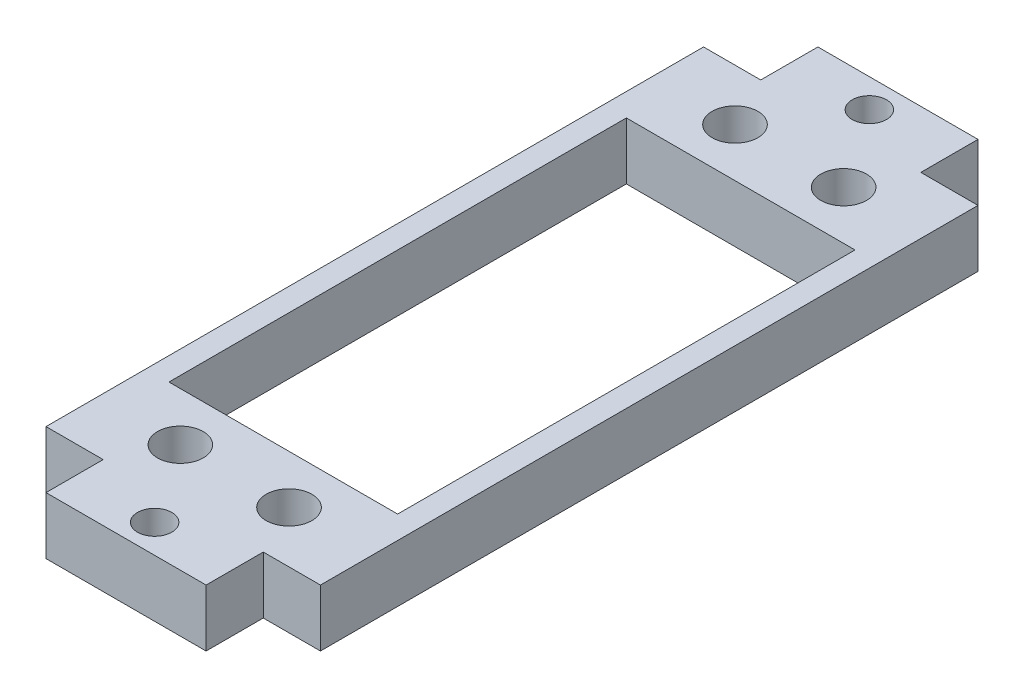
ISO-10303-21;
HEADER;
FILE_DESCRIPTION(('STEP AP214'),'2;1');
FILE_NAME('part.step','',(''),(''),'','','');
FILE_SCHEMA(('AUTOMOTIVE_DESIGN { 1 0 10303 214 1 1 1 1 }'));
ENDSEC;
DATA;
#1=APPLICATION_CONTEXT('core data for automotive mechanical design processes');
#2=APPLICATION_PROTOCOL_DEFINITION('international standard','automotive_design',2000,#1);
#3=PRODUCT_CONTEXT('',#1,'mechanical');
#4=PRODUCT('Part','Part','',(#3));
#5=PRODUCT_RELATED_PRODUCT_CATEGORY('part','',(#4));
#6=PRODUCT_DEFINITION_FORMATION('','',#4);
#7=PRODUCT_DEFINITION_CONTEXT('part definition',#1,'design');
#8=PRODUCT_DEFINITION('design','',#6,#7);
#9=PRODUCT_DEFINITION_SHAPE('','',#8);
#10=(LENGTH_UNIT() NAMED_UNIT(*) SI_UNIT(.MILLI.,.METRE.));
#11=(NAMED_UNIT(*) PLANE_ANGLE_UNIT() SI_UNIT($,.RADIAN.));
#12=(NAMED_UNIT(*) SI_UNIT($,.STERADIAN.) SOLID_ANGLE_UNIT());
#13=UNCERTAINTY_MEASURE_WITH_UNIT(LENGTH_MEASURE(1.E-05),#10,'distance_accuracy_value','');
#14=(GEOMETRIC_REPRESENTATION_CONTEXT(3) GLOBAL_UNCERTAINTY_ASSIGNED_CONTEXT((#13)) GLOBAL_UNIT_ASSIGNED_CONTEXT((#10,
#11,#12)) REPRESENTATION_CONTEXT('',''));
#15=CARTESIAN_POINT('',(0.,0.,0.));
#16=DIRECTION('',(0.,0.,1.));
#17=DIRECTION('',(1.,0.,0.));
#18=AXIS2_PLACEMENT_3D('',#15,#16,#17);
#19=CARTESIAN_POINT('',(0.,5.,0.));
#20=DIRECTION('',(0.,1.,0.));
#21=DIRECTION('',(0.,0.,1.));
#22=AXIS2_PLACEMENT_3D('',#19,#20,#21);
#23=PLANE('',#22);
#24=CARTESIAN_POINT('',(16.75,5.,-9.50000000000001));
#25=DIRECTION('',(0.,1.,0.));
#26=DIRECTION('',(0.,0.,-1.));
#27=AXIS2_PLACEMENT_3D('',#24,#25,#26);
#28=CIRCLE('',#27,2.);
#29=CARTESIAN_POINT('',(16.75,5.,-11.5));
#30=VERTEX_POINT('',#29);
#31=EDGE_CURVE('E545',#30,#30,#28,.T.);
#32=ORIENTED_EDGE('',*,*,#31,.F.);
#33=EDGE_LOOP('',(#32));
#34=FACE_BOUND('',#33,.T.);
#35=CARTESIAN_POINT('',(16.75,5.,-58.));
#36=DIRECTION('',(0.,1.,0.));
#37=DIRECTION('',(0.,0.,1.));
#38=AXIS2_PLACEMENT_3D('',#35,#36,#37);
#39=CIRCLE('',#38,2.);
#40=CARTESIAN_POINT('',(16.75,5.,-56.));
#41=VERTEX_POINT('',#40);
#42=EDGE_CURVE('E557',#41,#41,#39,.T.);
#43=ORIENTED_EDGE('',*,*,#42,.F.);
#44=EDGE_LOOP('',(#43));
#45=FACE_BOUND('',#44,.T.);
#46=CARTESIAN_POINT('',(12.,5.,-65.));
#47=DIRECTION('',(0.,1.,0.));
#48=DIRECTION('',(0.,0.,1.));
#49=AXIS2_PLACEMENT_3D('',#46,#47,#48);
#50=CIRCLE('',#49,1.5);
#51=CARTESIAN_POINT('',(12.,5.,-63.5));
#52=VERTEX_POINT('',#51);
#53=EDGE_CURVE('E175',#52,#52,#50,.T.);
#54=ORIENTED_EDGE('',*,*,#53,.F.);
#55=EDGE_LOOP('',(#54));
#56=FACE_BOUND('',#55,.T.);
#57=DIRECTION('',(0.,0.,1.));
#58=VECTOR('',#57,1.);
#59=CARTESIAN_POINT('',(5.,5.,-67.5));
#60=LINE('',#59,#58);
#61=CARTESIAN_POINT('',(5.,5.,-67.5));
#62=VERTEX_POINT('',#61);
#63=CARTESIAN_POINT('',(5.,5.,-62.5));
#64=VERTEX_POINT('',#63);
#65=EDGE_CURVE('E185',#62,#64,#60,.T.);
#66=ORIENTED_EDGE('',*,*,#65,.T.);
#67=DIRECTION('',(-1.,0.,0.));
#68=VECTOR('',#67,1.);
#69=CARTESIAN_POINT('',(0.,5.,-62.5));
#70=LINE('',#69,#68);
#71=CARTESIAN_POINT('',(0.,5.,-62.5));
#72=VERTEX_POINT('',#71);
#73=EDGE_CURVE('E188',#64,#72,#70,.T.);
#74=ORIENTED_EDGE('',*,*,#73,.T.);
#75=DIRECTION('',(0.,0.,1.));
#76=VECTOR('',#75,1.);
#77=CARTESIAN_POINT('',(0.,5.,-5.));
#78=LINE('',#77,#76);
#79=CARTESIAN_POINT('',(0.,5.,-5.));
#80=VERTEX_POINT('',#79);
#81=EDGE_CURVE('E191',#72,#80,#78,.T.);
#82=ORIENTED_EDGE('',*,*,#81,.T.);
#83=DIRECTION('',(1.,0.,0.));
#84=VECTOR('',#83,1.);
#85=CARTESIAN_POINT('',(0.,5.,-5.));
#86=LINE('',#85,#84);
#87=CARTESIAN_POINT('',(5.,5.,-5.));
#88=VERTEX_POINT('',#87);
#89=EDGE_CURVE('E193',#80,#88,#86,.T.);
#90=ORIENTED_EDGE('',*,*,#89,.T.);
#91=DIRECTION('',(0.,0.,1.));
#92=VECTOR('',#91,1.);
#93=CARTESIAN_POINT('',(5.,5.,0.));
#94=LINE('',#93,#92);
#95=CARTESIAN_POINT('',(5.,5.,0.));
#96=VERTEX_POINT('',#95);
#97=EDGE_CURVE('E195',#88,#96,#94,.T.);
#98=ORIENTED_EDGE('',*,*,#97,.T.);
#99=DIRECTION('',(1.,0.,0.));
#100=VECTOR('',#99,1.);
#101=CARTESIAN_POINT('',(5.,5.,0.));
#102=LINE('',#101,#100);
#103=CARTESIAN_POINT('',(19.,5.,0.));
#104=VERTEX_POINT('',#103);
#105=EDGE_CURVE('E197',#96,#104,#102,.T.);
#106=ORIENTED_EDGE('',*,*,#105,.T.);
#107=DIRECTION('',(0.,0.,-1.));
#108=VECTOR('',#107,1.);
#109=CARTESIAN_POINT('',(19.,5.,0.));
#110=LINE('',#109,#108);
#111=CARTESIAN_POINT('',(19.,5.,-5.));
#112=VERTEX_POINT('',#111);
#113=EDGE_CURVE('E199',#104,#112,#110,.T.);
#114=ORIENTED_EDGE('',*,*,#113,.T.);
#115=DIRECTION('',(1.,0.,0.));
#116=VECTOR('',#115,1.);
#117=CARTESIAN_POINT('',(24.,5.,-4.99999999999999));
#118=LINE('',#117,#116);
#119=CARTESIAN_POINT('',(24.,5.,-4.99999999999999));
#120=VERTEX_POINT('',#119);
#121=EDGE_CURVE('E201',#112,#120,#118,.T.);
#122=ORIENTED_EDGE('',*,*,#121,.T.);
#123=DIRECTION('',(0.,0.,-1.));
#124=VECTOR('',#123,1.);
#125=CARTESIAN_POINT('',(24.,5.,-4.99999999999999));
#126=LINE('',#125,#124);
#127=CARTESIAN_POINT('',(24.,5.,-62.5));
#128=VERTEX_POINT('',#127);
#129=EDGE_CURVE('E203',#120,#128,#126,.T.);
#130=ORIENTED_EDGE('',*,*,#129,.T.);
#131=DIRECTION('',(-1.,0.,0.));
#132=VECTOR('',#131,1.);
#133=CARTESIAN_POINT('',(24.,5.,-62.5));
#134=LINE('',#133,#132);
#135=CARTESIAN_POINT('',(19.,5.,-62.5));
#136=VERTEX_POINT('',#135);
#137=EDGE_CURVE('E205',#128,#136,#134,.T.);
#138=ORIENTED_EDGE('',*,*,#137,.T.);
#139=DIRECTION('',(0.,0.,-1.));
#140=VECTOR('',#139,1.);
#141=CARTESIAN_POINT('',(19.,5.,-67.5));
#142=LINE('',#141,#140);
#143=CARTESIAN_POINT('',(19.,5.,-67.5));
#144=VERTEX_POINT('',#143);
#145=EDGE_CURVE('E207',#136,#144,#142,.T.);
#146=ORIENTED_EDGE('',*,*,#145,.T.);
#147=DIRECTION('',(-1.,0.,0.));
#148=VECTOR('',#147,1.);
#149=CARTESIAN_POINT('',(5.,5.,-67.5));
#150=LINE('',#149,#148);
#151=EDGE_CURVE('E209',#144,#62,#150,.T.);
#152=ORIENTED_EDGE('',*,*,#151,.T.);
#153=EDGE_LOOP('',(#66,#74,#82,#90,#98,#106,#114,#122,#130,#138,#146,#152));
#154=FACE_BOUND('',#153,.T.);
#155=DIRECTION('',(-1.,0.,0.));
#156=VECTOR('',#155,1.);
#157=CARTESIAN_POINT('',(1.99999999999999,5.,-53.75));
#158=LINE('',#157,#156);
#159=CARTESIAN_POINT('',(22.,5.,-53.75));
#160=VERTEX_POINT('',#159);
#161=CARTESIAN_POINT('',(1.99999999999999,5.,-53.75));
#162=VERTEX_POINT('',#161);
#163=EDGE_CURVE('E154',#160,#162,#158,.T.);
#164=ORIENTED_EDGE('',*,*,#163,.F.);
#165=DIRECTION('',(0.,0.,-1.));
#166=VECTOR('',#165,1.);
#167=CARTESIAN_POINT('',(22.,5.,-13.75));
#168=LINE('',#167,#166);
#169=CARTESIAN_POINT('',(22.,5.,-13.75));
#170=VERTEX_POINT('',#169);
#171=EDGE_CURVE('E146',#170,#160,#168,.T.);
#172=ORIENTED_EDGE('',*,*,#171,.F.);
#173=DIRECTION('',(1.,0.,0.));
#174=VECTOR('',#173,1.);
#175=CARTESIAN_POINT('',(2.,5.,-13.75));
#176=LINE('',#175,#174);
#177=CARTESIAN_POINT('',(2.,5.,-13.75));
#178=VERTEX_POINT('',#177);
#179=EDGE_CURVE('E169',#178,#170,#176,.T.);
#180=ORIENTED_EDGE('',*,*,#179,.F.);
#181=DIRECTION('',(0.,0.,1.));
#182=VECTOR('',#181,1.);
#183=CARTESIAN_POINT('',(2.,5.,-13.75));
#184=LINE('',#183,#182);
#185=EDGE_CURVE('E167',#162,#178,#184,.T.);
#186=ORIENTED_EDGE('',*,*,#185,.F.);
#187=EDGE_LOOP('',(#164,#172,#180,#186));
#188=FACE_BOUND('',#187,.T.);
#189=CARTESIAN_POINT('',(12.,5.,-2.5));
#190=DIRECTION('',(0.,1.,0.));
#191=DIRECTION('',(0.,0.,-1.));
#192=AXIS2_PLACEMENT_3D('',#189,#190,#191);
#193=CIRCLE('',#192,1.5);
#194=CARTESIAN_POINT('',(12.,5.,-4.));
#195=VERTEX_POINT('',#194);
#196=EDGE_CURVE('E563',#195,#195,#193,.T.);
#197=ORIENTED_EDGE('',*,*,#196,.F.);
#198=EDGE_LOOP('',(#197));
#199=FACE_BOUND('',#198,.T.);
#200=CARTESIAN_POINT('',(7.24999999999998,5.,-58.));
#201=DIRECTION('',(0.,1.,0.));
#202=DIRECTION('',(0.,0.,-1.));
#203=AXIS2_PLACEMENT_3D('',#200,#201,#202);
#204=CIRCLE('',#203,2.);
#205=CARTESIAN_POINT('',(7.24999999999998,5.,-60.));
#206=VERTEX_POINT('',#205);
#207=EDGE_CURVE('E551',#206,#206,#204,.T.);
#208=ORIENTED_EDGE('',*,*,#207,.F.);
#209=EDGE_LOOP('',(#208));
#210=FACE_BOUND('',#209,.T.);
#211=CARTESIAN_POINT('',(7.24999999999998,5.,-9.50000000000001));
#212=DIRECTION('',(0.,1.,0.));
#213=DIRECTION('',(0.,0.,1.));
#214=AXIS2_PLACEMENT_3D('',#211,#212,#213);
#215=CIRCLE('',#214,2.);
#216=CARTESIAN_POINT('',(7.24999999999998,5.,-7.50000000000001));
#217=VERTEX_POINT('',#216);
#218=EDGE_CURVE('E536',#217,#217,#215,.T.);
#219=ORIENTED_EDGE('',*,*,#218,.F.);
#220=EDGE_LOOP('',(#219));
#221=FACE_BOUND('',#220,.T.);
#222=ADVANCED_FACE('F33',(#34,#45,#56,#154,#188,#199,#210,#221),#23,.T.);
#223=CARTESIAN_POINT('',(0.,0.,0.));
#224=DIRECTION('',(0.,1.,0.));
#225=DIRECTION('',(0.,0.,1.));
#226=AXIS2_PLACEMENT_3D('',#223,#224,#225);
#227=PLANE('',#226);
#228=DIRECTION('',(0.,0.,1.));
#229=VECTOR('',#228,1.);
#230=CARTESIAN_POINT('',(5.,0.,-67.5));
#231=LINE('',#230,#229);
#232=CARTESIAN_POINT('',(5.,0.,-67.5));
#233=VERTEX_POINT('',#232);
#234=CARTESIAN_POINT('',(5.,0.,-62.5));
#235=VERTEX_POINT('',#234);
#236=EDGE_CURVE('E162',#233,#235,#231,.T.);
#237=ORIENTED_EDGE('',*,*,#236,.F.);
#238=DIRECTION('',(-1.,0.,0.));
#239=VECTOR('',#238,1.);
#240=CARTESIAN_POINT('',(5.,0.,-67.5));
#241=LINE('',#240,#239);
#242=CARTESIAN_POINT('',(19.,0.,-67.5));
#243=VERTEX_POINT('',#242);
#244=EDGE_CURVE('E189',#243,#233,#241,.T.);
#245=ORIENTED_EDGE('',*,*,#244,.F.);
#246=DIRECTION('',(0.,0.,-1.));
#247=VECTOR('',#246,1.);
#248=CARTESIAN_POINT('',(19.,0.,-67.5));
#249=LINE('',#248,#247);
#250=CARTESIAN_POINT('',(19.,0.,-62.5));
#251=VERTEX_POINT('',#250);
#252=EDGE_CURVE('E232',#251,#243,#249,.T.);
#253=ORIENTED_EDGE('',*,*,#252,.F.);
#254=DIRECTION('',(-1.,0.,0.));
#255=VECTOR('',#254,1.);
#256=CARTESIAN_POINT('',(24.,0.,-62.5));
#257=LINE('',#256,#255);
#258=CARTESIAN_POINT('',(24.,0.,-62.5));
#259=VERTEX_POINT('',#258);
#260=EDGE_CURVE('E230',#259,#251,#257,.T.);
#261=ORIENTED_EDGE('',*,*,#260,.F.);
#262=DIRECTION('',(0.,0.,-1.));
#263=VECTOR('',#262,1.);
#264=CARTESIAN_POINT('',(24.,0.,-4.99999999999999));
#265=LINE('',#264,#263);
#266=CARTESIAN_POINT('',(24.,0.,-4.99999999999999));
#267=VERTEX_POINT('',#266);
#268=EDGE_CURVE('E228',#267,#259,#265,.T.);
#269=ORIENTED_EDGE('',*,*,#268,.F.);
#270=DIRECTION('',(1.,0.,0.));
#271=VECTOR('',#270,1.);
#272=CARTESIAN_POINT('',(24.,0.,-4.99999999999999));
#273=LINE('',#272,#271);
#274=CARTESIAN_POINT('',(19.,0.,-5.));
#275=VERTEX_POINT('',#274);
#276=EDGE_CURVE('E226',#275,#267,#273,.T.);
#277=ORIENTED_EDGE('',*,*,#276,.F.);
#278=DIRECTION('',(0.,0.,-1.));
#279=VECTOR('',#278,1.);
#280=CARTESIAN_POINT('',(19.,0.,0.));
#281=LINE('',#280,#279);
#282=CARTESIAN_POINT('',(19.,0.,0.));
#283=VERTEX_POINT('',#282);
#284=EDGE_CURVE('E224',#283,#275,#281,.T.);
#285=ORIENTED_EDGE('',*,*,#284,.F.);
#286=DIRECTION('',(1.,0.,0.));
#287=VECTOR('',#286,1.);
#288=CARTESIAN_POINT('',(5.,0.,0.));
#289=LINE('',#288,#287);
#290=CARTESIAN_POINT('',(5.,0.,0.));
#291=VERTEX_POINT('',#290);
#292=EDGE_CURVE('E222',#291,#283,#289,.T.);
#293=ORIENTED_EDGE('',*,*,#292,.F.);
#294=DIRECTION('',(0.,0.,1.));
#295=VECTOR('',#294,1.);
#296=CARTESIAN_POINT('',(5.,0.,0.));
#297=LINE('',#296,#295);
#298=CARTESIAN_POINT('',(5.,0.,-5.));
#299=VERTEX_POINT('',#298);
#300=EDGE_CURVE('E220',#299,#291,#297,.T.);
#301=ORIENTED_EDGE('',*,*,#300,.F.);
#302=DIRECTION('',(1.,0.,0.));
#303=VECTOR('',#302,1.);
#304=CARTESIAN_POINT('',(0.,0.,-5.));
#305=LINE('',#304,#303);
#306=CARTESIAN_POINT('',(0.,0.,-5.));
#307=VERTEX_POINT('',#306);
#308=EDGE_CURVE('E218',#307,#299,#305,.T.);
#309=ORIENTED_EDGE('',*,*,#308,.F.);
#310=DIRECTION('',(0.,0.,1.));
#311=VECTOR('',#310,1.);
#312=CARTESIAN_POINT('',(0.,0.,-5.));
#313=LINE('',#312,#311);
#314=CARTESIAN_POINT('',(0.,0.,-62.5));
#315=VERTEX_POINT('',#314);
#316=EDGE_CURVE('E216',#315,#307,#313,.T.);
#317=ORIENTED_EDGE('',*,*,#316,.F.);
#318=DIRECTION('',(-1.,0.,0.));
#319=VECTOR('',#318,1.);
#320=CARTESIAN_POINT('',(0.,0.,-62.5));
#321=LINE('',#320,#319);
#322=EDGE_CURVE('E214',#235,#315,#321,.T.);
#323=ORIENTED_EDGE('',*,*,#322,.F.);
#324=EDGE_LOOP('',(#237,#245,#253,#261,#269,#277,#285,#293,#301,#309,#317,#323));
#325=FACE_BOUND('',#324,.T.);
#326=DIRECTION('',(0.,0.,-1.));
#327=VECTOR('',#326,1.);
#328=CARTESIAN_POINT('',(22.,0.,-13.75));
#329=LINE('',#328,#327);
#330=CARTESIAN_POINT('',(22.,0.,-13.75));
#331=VERTEX_POINT('',#330);
#332=CARTESIAN_POINT('',(22.,0.,-53.75));
#333=VERTEX_POINT('',#332);
#334=EDGE_CURVE('E56',#331,#333,#329,.T.);
#335=ORIENTED_EDGE('',*,*,#334,.T.);
#336=DIRECTION('',(-1.,0.,0.));
#337=VECTOR('',#336,1.);
#338=CARTESIAN_POINT('',(1.99999999999999,0.,-53.75));
#339=LINE('',#338,#337);
#340=CARTESIAN_POINT('',(1.99999999999999,0.,-53.75));
#341=VERTEX_POINT('',#340);
#342=EDGE_CURVE('E161',#333,#341,#339,.T.);
#343=ORIENTED_EDGE('',*,*,#342,.T.);
#344=DIRECTION('',(0.,0.,1.));
#345=VECTOR('',#344,1.);
#346=CARTESIAN_POINT('',(2.,0.,-13.75));
#347=LINE('',#346,#345);
#348=CARTESIAN_POINT('',(2.,0.,-13.75));
#349=VERTEX_POINT('',#348);
#350=EDGE_CURVE('E177',#341,#349,#347,.T.);
#351=ORIENTED_EDGE('',*,*,#350,.T.);
#352=DIRECTION('',(1.,0.,0.));
#353=VECTOR('',#352,1.);
#354=CARTESIAN_POINT('',(2.,0.,-13.75));
#355=LINE('',#354,#353);
#356=EDGE_CURVE('E155',#349,#331,#355,.T.);
#357=ORIENTED_EDGE('',*,*,#356,.T.);
#358=EDGE_LOOP('',(#335,#343,#351,#357));
#359=FACE_BOUND('',#358,.T.);
#360=CARTESIAN_POINT('',(12.,0.,-65.));
#361=DIRECTION('',(0.,1.,0.));
#362=DIRECTION('',(0.,0.,1.));
#363=AXIS2_PLACEMENT_3D('',#360,#361,#362);
#364=CIRCLE('',#363,1.5);
#365=CARTESIAN_POINT('',(12.,0.,-63.5));
#366=VERTEX_POINT('',#365);
#367=EDGE_CURVE('E566',#366,#366,#364,.T.);
#368=ORIENTED_EDGE('',*,*,#367,.T.);
#369=EDGE_LOOP('',(#368));
#370=FACE_BOUND('',#369,.T.);
#371=CARTESIAN_POINT('',(12.,0.,-2.5));
#372=DIRECTION('',(0.,1.,0.));
#373=DIRECTION('',(0.,0.,-1.));
#374=AXIS2_PLACEMENT_3D('',#371,#372,#373);
#375=CIRCLE('',#374,1.5);
#376=CARTESIAN_POINT('',(12.,0.,-4.));
#377=VERTEX_POINT('',#376);
#378=EDGE_CURVE('E560',#377,#377,#375,.T.);
#379=ORIENTED_EDGE('',*,*,#378,.T.);
#380=EDGE_LOOP('',(#379));
#381=FACE_BOUND('',#380,.T.);
#382=CARTESIAN_POINT('',(16.75,0.,-58.));
#383=DIRECTION('',(0.,1.,0.));
#384=DIRECTION('',(0.,0.,1.));
#385=AXIS2_PLACEMENT_3D('',#382,#383,#384);
#386=CIRCLE('',#385,2.);
#387=CARTESIAN_POINT('',(16.75,0.,-56.));
#388=VERTEX_POINT('',#387);
#389=EDGE_CURVE('E554',#388,#388,#386,.T.);
#390=ORIENTED_EDGE('',*,*,#389,.T.);
#391=EDGE_LOOP('',(#390));
#392=FACE_BOUND('',#391,.T.);
#393=CARTESIAN_POINT('',(7.24999999999998,0.,-58.));
#394=DIRECTION('',(0.,1.,0.));
#395=DIRECTION('',(0.,0.,-1.));
#396=AXIS2_PLACEMENT_3D('',#393,#394,#395);
#397=CIRCLE('',#396,2.);
#398=CARTESIAN_POINT('',(7.24999999999998,0.,-60.));
#399=VERTEX_POINT('',#398);
#400=EDGE_CURVE('E548',#399,#399,#397,.T.);
#401=ORIENTED_EDGE('',*,*,#400,.T.);
#402=EDGE_LOOP('',(#401));
#403=FACE_BOUND('',#402,.T.);
#404=CARTESIAN_POINT('',(16.75,0.,-9.50000000000001));
#405=DIRECTION('',(0.,1.,0.));
#406=DIRECTION('',(0.,0.,-1.));
#407=AXIS2_PLACEMENT_3D('',#404,#405,#406);
#408=CIRCLE('',#407,2.);
#409=CARTESIAN_POINT('',(16.75,0.,-11.5));
#410=VERTEX_POINT('',#409);
#411=EDGE_CURVE('E542',#410,#410,#408,.T.);
#412=ORIENTED_EDGE('',*,*,#411,.T.);
#413=EDGE_LOOP('',(#412));
#414=FACE_BOUND('',#413,.T.);
#415=CARTESIAN_POINT('',(7.24999999999998,0.,-9.50000000000001));
#416=DIRECTION('',(0.,1.,0.));
#417=DIRECTION('',(0.,0.,1.));
#418=AXIS2_PLACEMENT_3D('',#415,#416,#417);
#419=CIRCLE('',#418,2.);
#420=CARTESIAN_POINT('',(7.24999999999998,0.,-7.50000000000001));
#421=VERTEX_POINT('',#420);
#422=EDGE_CURVE('E539',#421,#421,#419,.T.);
#423=ORIENTED_EDGE('',*,*,#422,.T.);
#424=EDGE_LOOP('',(#423));
#425=FACE_BOUND('',#424,.T.);
#426=ADVANCED_FACE('F274',(#325,#359,#370,#381,#392,#403,#414,#425),#227,.F.);
#427=CARTESIAN_POINT('',(5.,5.,-67.5));
#428=DIRECTION('',(1.,0.,0.));
#429=DIRECTION('',(0.,0.,-1.));
#430=AXIS2_PLACEMENT_3D('',#427,#428,#429);
#431=PLANE('',#430);
#432=ORIENTED_EDGE('',*,*,#236,.T.);
#433=DIRECTION('',(0.,-1.,0.));
#434=VECTOR('',#433,1.);
#435=CARTESIAN_POINT('',(5.,5.,-62.5));
#436=LINE('',#435,#434);
#437=EDGE_CURVE('E11',#64,#235,#436,.T.);
#438=ORIENTED_EDGE('',*,*,#437,.F.);
#439=ORIENTED_EDGE('',*,*,#65,.F.);
#440=DIRECTION('',(0.,-1.,0.));
#441=VECTOR('',#440,1.);
#442=CARTESIAN_POINT('',(5.,5.,-67.5));
#443=LINE('',#442,#441);
#444=EDGE_CURVE('E211',#62,#233,#443,.T.);
#445=ORIENTED_EDGE('',*,*,#444,.T.);
#446=EDGE_LOOP('',(#432,#438,#439,#445));
#447=FACE_BOUND('',#446,.T.);
#448=ADVANCED_FACE('F35',(#447),#431,.F.);
#449=CARTESIAN_POINT('',(0.,5.,-62.5));
#450=DIRECTION('',(0.,0.,1.));
#451=DIRECTION('',(1.,0.,0.));
#452=AXIS2_PLACEMENT_3D('',#449,#450,#451);
#453=PLANE('',#452);
#454=ORIENTED_EDGE('',*,*,#322,.T.);
#455=DIRECTION('',(0.,-1.,0.));
#456=VECTOR('',#455,1.);
#457=CARTESIAN_POINT('',(0.,5.,-62.5));
#458=LINE('',#457,#456);
#459=EDGE_CURVE('E41',#72,#315,#458,.T.);
#460=ORIENTED_EDGE('',*,*,#459,.F.);
#461=ORIENTED_EDGE('',*,*,#73,.F.);
#462=ORIENTED_EDGE('',*,*,#437,.T.);
#463=EDGE_LOOP('',(#454,#460,#461,#462));
#464=FACE_BOUND('',#463,.T.);
#465=ADVANCED_FACE('F291',(#464),#453,.F.);
#466=CARTESIAN_POINT('',(0.,5.,-5.));
#467=DIRECTION('',(1.,0.,0.));
#468=DIRECTION('',(0.,0.,-1.));
#469=AXIS2_PLACEMENT_3D('',#466,#467,#468);
#470=PLANE('',#469);
#471=ORIENTED_EDGE('',*,*,#316,.T.);
#472=DIRECTION('',(0.,-1.,0.));
#473=VECTOR('',#472,1.);
#474=CARTESIAN_POINT('',(0.,5.,-5.));
#475=LINE('',#474,#473);
#476=EDGE_CURVE('E261',#80,#307,#475,.T.);
#477=ORIENTED_EDGE('',*,*,#476,.F.);
#478=ORIENTED_EDGE('',*,*,#81,.F.);
#479=ORIENTED_EDGE('',*,*,#459,.T.);
#480=EDGE_LOOP('',(#471,#477,#478,#479));
#481=FACE_BOUND('',#480,.T.);
#482=ADVANCED_FACE('F268',(#481),#470,.F.);
#483=CARTESIAN_POINT('',(0.,5.,-5.));
#484=DIRECTION('',(0.,0.,-1.));
#485=DIRECTION('',(-1.,0.,0.));
#486=AXIS2_PLACEMENT_3D('',#483,#484,#485);
#487=PLANE('',#486);
#488=ORIENTED_EDGE('',*,*,#308,.T.);
#489=DIRECTION('',(0.,-1.,0.));
#490=VECTOR('',#489,1.);
#491=CARTESIAN_POINT('',(5.,5.,-5.));
#492=LINE('',#491,#490);
#493=EDGE_CURVE('E258',#88,#299,#492,.T.);
#494=ORIENTED_EDGE('',*,*,#493,.F.);
#495=ORIENTED_EDGE('',*,*,#89,.F.);
#496=ORIENTED_EDGE('',*,*,#476,.T.);
#497=EDGE_LOOP('',(#488,#494,#495,#496));
#498=FACE_BOUND('',#497,.T.);
#499=ADVANCED_FACE('F280',(#498),#487,.F.);
#500=CARTESIAN_POINT('',(5.,5.,0.));
#501=DIRECTION('',(1.,0.,0.));
#502=DIRECTION('',(0.,0.,-1.));
#503=AXIS2_PLACEMENT_3D('',#500,#501,#502);
#504=PLANE('',#503);
#505=ORIENTED_EDGE('',*,*,#300,.T.);
#506=DIRECTION('',(0.,-1.,0.));
#507=VECTOR('',#506,1.);
#508=CARTESIAN_POINT('',(5.,5.,0.));
#509=LINE('',#508,#507);
#510=EDGE_CURVE('E255',#96,#291,#509,.T.);
#511=ORIENTED_EDGE('',*,*,#510,.F.);
#512=ORIENTED_EDGE('',*,*,#97,.F.);
#513=ORIENTED_EDGE('',*,*,#493,.T.);
#514=EDGE_LOOP('',(#505,#511,#512,#513));
#515=FACE_BOUND('',#514,.T.);
#516=ADVANCED_FACE('F284',(#515),#504,.F.);
#517=CARTESIAN_POINT('',(5.,5.,0.));
#518=DIRECTION('',(0.,0.,-1.));
#519=DIRECTION('',(-1.,0.,0.));
#520=AXIS2_PLACEMENT_3D('',#517,#518,#519);
#521=PLANE('',#520);
#522=ORIENTED_EDGE('',*,*,#292,.T.);
#523=DIRECTION('',(0.,-1.,0.));
#524=VECTOR('',#523,1.);
#525=CARTESIAN_POINT('',(19.,5.,0.));
#526=LINE('',#525,#524);
#527=EDGE_CURVE('E252',#104,#283,#526,.T.);
#528=ORIENTED_EDGE('',*,*,#527,.F.);
#529=ORIENTED_EDGE('',*,*,#105,.F.);
#530=ORIENTED_EDGE('',*,*,#510,.T.);
#531=EDGE_LOOP('',(#522,#528,#529,#530));
#532=FACE_BOUND('',#531,.T.);
#533=ADVANCED_FACE('F324',(#532),#521,.F.);
#534=CARTESIAN_POINT('',(19.,5.,0.));
#535=DIRECTION('',(-1.,0.,0.));
#536=DIRECTION('',(0.,0.,1.));
#537=AXIS2_PLACEMENT_3D('',#534,#535,#536);
#538=PLANE('',#537);
#539=ORIENTED_EDGE('',*,*,#284,.T.);
#540=DIRECTION('',(0.,-1.,0.));
#541=VECTOR('',#540,1.);
#542=CARTESIAN_POINT('',(19.,5.,-5.));
#543=LINE('',#542,#541);
#544=EDGE_CURVE('E249',#112,#275,#543,.T.);
#545=ORIENTED_EDGE('',*,*,#544,.F.);
#546=ORIENTED_EDGE('',*,*,#113,.F.);
#547=ORIENTED_EDGE('',*,*,#527,.T.);
#548=EDGE_LOOP('',(#539,#545,#546,#547));
#549=FACE_BOUND('',#548,.T.);
#550=ADVANCED_FACE('F322',(#549),#538,.F.);
#551=CARTESIAN_POINT('',(24.,5.,-4.99999999999999));
#552=DIRECTION('',(0.,0.,-1.));
#553=DIRECTION('',(-1.,0.,0.));
#554=AXIS2_PLACEMENT_3D('',#551,#552,#553);
#555=PLANE('',#554);
#556=ORIENTED_EDGE('',*,*,#276,.T.);
#557=DIRECTION('',(0.,-1.,0.));
#558=VECTOR('',#557,1.);
#559=CARTESIAN_POINT('',(24.,5.,-4.99999999999999));
#560=LINE('',#559,#558);
#561=EDGE_CURVE('E246',#120,#267,#560,.T.);
#562=ORIENTED_EDGE('',*,*,#561,.F.);
#563=ORIENTED_EDGE('',*,*,#121,.F.);
#564=ORIENTED_EDGE('',*,*,#544,.T.);
#565=EDGE_LOOP('',(#556,#562,#563,#564));
#566=FACE_BOUND('',#565,.T.);
#567=ADVANCED_FACE('F318',(#566),#555,.F.);
#568=CARTESIAN_POINT('',(24.,5.,-4.99999999999999));
#569=DIRECTION('',(-1.,0.,0.));
#570=DIRECTION('',(0.,0.,1.));
#571=AXIS2_PLACEMENT_3D('',#568,#569,#570);
#572=PLANE('',#571);
#573=ORIENTED_EDGE('',*,*,#268,.T.);
#574=DIRECTION('',(0.,-1.,0.));
#575=VECTOR('',#574,1.);
#576=CARTESIAN_POINT('',(24.,5.,-62.5));
#577=LINE('',#576,#575);
#578=EDGE_CURVE('E243',#128,#259,#577,.T.);
#579=ORIENTED_EDGE('',*,*,#578,.F.);
#580=ORIENTED_EDGE('',*,*,#129,.F.);
#581=ORIENTED_EDGE('',*,*,#561,.T.);
#582=EDGE_LOOP('',(#573,#579,#580,#581));
#583=FACE_BOUND('',#582,.T.);
#584=ADVANCED_FACE('F313',(#583),#572,.F.);
#585=CARTESIAN_POINT('',(24.,5.,-62.5));
#586=DIRECTION('',(0.,0.,1.));
#587=DIRECTION('',(1.,0.,0.));
#588=AXIS2_PLACEMENT_3D('',#585,#586,#587);
#589=PLANE('',#588);
#590=ORIENTED_EDGE('',*,*,#260,.T.);
#591=DIRECTION('',(0.,-1.,0.));
#592=VECTOR('',#591,1.);
#593=CARTESIAN_POINT('',(19.,5.,-62.5));
#594=LINE('',#593,#592);
#595=EDGE_CURVE('E240',#136,#251,#594,.T.);
#596=ORIENTED_EDGE('',*,*,#595,.F.);
#597=ORIENTED_EDGE('',*,*,#137,.F.);
#598=ORIENTED_EDGE('',*,*,#578,.T.);
#599=EDGE_LOOP('',(#590,#596,#597,#598));
#600=FACE_BOUND('',#599,.T.);
#601=ADVANCED_FACE('F307',(#600),#589,.F.);
#602=CARTESIAN_POINT('',(19.,5.,-67.5));
#603=DIRECTION('',(-1.,0.,0.));
#604=DIRECTION('',(0.,0.,1.));
#605=AXIS2_PLACEMENT_3D('',#602,#603,#604);
#606=PLANE('',#605);
#607=ORIENTED_EDGE('',*,*,#252,.T.);
#608=DIRECTION('',(0.,-1.,0.));
#609=VECTOR('',#608,1.);
#610=CARTESIAN_POINT('',(19.,5.,-67.5));
#611=LINE('',#610,#609);
#612=EDGE_CURVE('E237',#144,#243,#611,.T.);
#613=ORIENTED_EDGE('',*,*,#612,.F.);
#614=ORIENTED_EDGE('',*,*,#145,.F.);
#615=ORIENTED_EDGE('',*,*,#595,.T.);
#616=EDGE_LOOP('',(#607,#613,#614,#615));
#617=FACE_BOUND('',#616,.T.);
#618=ADVANCED_FACE('F303',(#617),#606,.F.);
#619=CARTESIAN_POINT('',(5.,5.,-67.5));
#620=DIRECTION('',(0.,0.,1.));
#621=DIRECTION('',(1.,0.,0.));
#622=AXIS2_PLACEMENT_3D('',#619,#620,#621);
#623=PLANE('',#622);
#624=ORIENTED_EDGE('',*,*,#244,.T.);
#625=ORIENTED_EDGE('',*,*,#444,.F.);
#626=ORIENTED_EDGE('',*,*,#151,.F.);
#627=ORIENTED_EDGE('',*,*,#612,.T.);
#628=EDGE_LOOP('',(#624,#625,#626,#627));
#629=FACE_BOUND('',#628,.T.);
#630=ADVANCED_FACE('F298',(#629),#623,.F.);
#631=CARTESIAN_POINT('',(22.,5.,-13.75));
#632=DIRECTION('',(-1.,0.,0.));
#633=DIRECTION('',(0.,0.,1.));
#634=AXIS2_PLACEMENT_3D('',#631,#632,#633);
#635=PLANE('',#634);
#636=ORIENTED_EDGE('',*,*,#334,.F.);
#637=DIRECTION('',(0.,-1.,0.));
#638=VECTOR('',#637,1.);
#639=CARTESIAN_POINT('',(22.,5.,-13.75));
#640=LINE('',#639,#638);
#641=EDGE_CURVE('E150',#170,#331,#640,.T.);
#642=ORIENTED_EDGE('',*,*,#641,.F.);
#643=ORIENTED_EDGE('',*,*,#171,.T.);
#644=DIRECTION('',(0.,-1.,0.));
#645=VECTOR('',#644,1.);
#646=CARTESIAN_POINT('',(22.,5.,-53.75));
#647=LINE('',#646,#645);
#648=EDGE_CURVE('E149',#160,#333,#647,.T.);
#649=ORIENTED_EDGE('',*,*,#648,.T.);
#650=EDGE_LOOP('',(#636,#642,#643,#649));
#651=FACE_BOUND('',#650,.T.);
#652=ADVANCED_FACE('F148',(#651),#635,.T.);
#653=CARTESIAN_POINT('',(1.99999999999999,5.,-53.75));
#654=DIRECTION('',(0.,0.,1.));
#655=DIRECTION('',(1.,0.,0.));
#656=AXIS2_PLACEMENT_3D('',#653,#654,#655);
#657=PLANE('',#656);
#658=ORIENTED_EDGE('',*,*,#342,.F.);
#659=ORIENTED_EDGE('',*,*,#648,.F.);
#660=ORIENTED_EDGE('',*,*,#163,.T.);
#661=DIRECTION('',(0.,-1.,0.));
#662=VECTOR('',#661,1.);
#663=CARTESIAN_POINT('',(1.99999999999999,5.,-53.75));
#664=LINE('',#663,#662);
#665=EDGE_CURVE('E163',#162,#341,#664,.T.);
#666=ORIENTED_EDGE('',*,*,#665,.T.);
#667=EDGE_LOOP('',(#658,#659,#660,#666));
#668=FACE_BOUND('',#667,.T.);
#669=ADVANCED_FACE('F158',(#668),#657,.T.);
#670=CARTESIAN_POINT('',(2.,5.,-13.75));
#671=DIRECTION('',(1.,0.,0.));
#672=DIRECTION('',(0.,0.,-1.));
#673=AXIS2_PLACEMENT_3D('',#670,#671,#672);
#674=PLANE('',#673);
#675=ORIENTED_EDGE('',*,*,#350,.F.);
#676=ORIENTED_EDGE('',*,*,#665,.F.);
#677=ORIENTED_EDGE('',*,*,#185,.T.);
#678=DIRECTION('',(0.,-1.,0.));
#679=VECTOR('',#678,1.);
#680=CARTESIAN_POINT('',(2.,5.,-13.75));
#681=LINE('',#680,#679);
#682=EDGE_CURVE('E48',#178,#349,#681,.T.);
#683=ORIENTED_EDGE('',*,*,#682,.T.);
#684=EDGE_LOOP('',(#675,#676,#677,#683));
#685=FACE_BOUND('',#684,.T.);
#686=ADVANCED_FACE('F385',(#685),#674,.T.);
#687=CARTESIAN_POINT('',(2.,5.,-13.75));
#688=DIRECTION('',(0.,0.,-1.));
#689=DIRECTION('',(-1.,0.,0.));
#690=AXIS2_PLACEMENT_3D('',#687,#688,#689);
#691=PLANE('',#690);
#692=ORIENTED_EDGE('',*,*,#356,.F.);
#693=ORIENTED_EDGE('',*,*,#682,.F.);
#694=ORIENTED_EDGE('',*,*,#179,.T.);
#695=ORIENTED_EDGE('',*,*,#641,.T.);
#696=EDGE_LOOP('',(#692,#693,#694,#695));
#697=FACE_BOUND('',#696,.T.);
#698=ADVANCED_FACE('F391',(#697),#691,.T.);
#699=CARTESIAN_POINT('',(12.,5.,-65.));
#700=DIRECTION('',(0.,-1.,0.));
#701=DIRECTION('',(0.,0.,-1.));
#702=AXIS2_PLACEMENT_3D('',#699,#700,#701);
#703=CYLINDRICAL_SURFACE('',#702,1.5);
#704=ORIENTED_EDGE('',*,*,#53,.T.);
#705=EDGE_LOOP('',(#704));
#706=FACE_BOUND('',#705,.T.);
#707=ORIENTED_EDGE('',*,*,#367,.F.);
#708=EDGE_LOOP('',(#707));
#709=FACE_BOUND('',#708,.T.);
#710=ADVANCED_FACE('F399',(#706,#709),#703,.F.);
#711=CARTESIAN_POINT('',(12.,5.,-2.5));
#712=DIRECTION('',(0.,-1.,0.));
#713=DIRECTION('',(0.,0.,-1.));
#714=AXIS2_PLACEMENT_3D('',#711,#712,#713);
#715=CYLINDRICAL_SURFACE('',#714,1.5);
#716=ORIENTED_EDGE('',*,*,#196,.T.);
#717=EDGE_LOOP('',(#716));
#718=FACE_BOUND('',#717,.T.);
#719=ORIENTED_EDGE('',*,*,#378,.F.);
#720=EDGE_LOOP('',(#719));
#721=FACE_BOUND('',#720,.T.);
#722=ADVANCED_FACE('F406',(#718,#721),#715,.F.);
#723=CARTESIAN_POINT('',(16.75,5.,-58.));
#724=DIRECTION('',(0.,-1.,0.));
#725=DIRECTION('',(0.,0.,-1.));
#726=AXIS2_PLACEMENT_3D('',#723,#724,#725);
#727=CYLINDRICAL_SURFACE('',#726,2.);
#728=ORIENTED_EDGE('',*,*,#42,.T.);
#729=EDGE_LOOP('',(#728));
#730=FACE_BOUND('',#729,.T.);
#731=ORIENTED_EDGE('',*,*,#389,.F.);
#732=EDGE_LOOP('',(#731));
#733=FACE_BOUND('',#732,.T.);
#734=ADVANCED_FACE('F414',(#730,#733),#727,.F.);
#735=CARTESIAN_POINT('',(7.24999999999998,5.,-58.));
#736=DIRECTION('',(0.,-1.,0.));
#737=DIRECTION('',(0.,0.,-1.));
#738=AXIS2_PLACEMENT_3D('',#735,#736,#737);
#739=CYLINDRICAL_SURFACE('',#738,2.);
#740=ORIENTED_EDGE('',*,*,#207,.T.);
#741=EDGE_LOOP('',(#740));
#742=FACE_BOUND('',#741,.T.);
#743=ORIENTED_EDGE('',*,*,#400,.F.);
#744=EDGE_LOOP('',(#743));
#745=FACE_BOUND('',#744,.T.);
#746=ADVANCED_FACE('F422',(#742,#745),#739,.F.);
#747=CARTESIAN_POINT('',(16.75,5.,-9.50000000000001));
#748=DIRECTION('',(0.,-1.,0.));
#749=DIRECTION('',(0.,0.,-1.));
#750=AXIS2_PLACEMENT_3D('',#747,#748,#749);
#751=CYLINDRICAL_SURFACE('',#750,2.);
#752=ORIENTED_EDGE('',*,*,#31,.T.);
#753=EDGE_LOOP('',(#752));
#754=FACE_BOUND('',#753,.T.);
#755=ORIENTED_EDGE('',*,*,#411,.F.);
#756=EDGE_LOOP('',(#755));
#757=FACE_BOUND('',#756,.T.);
#758=ADVANCED_FACE('F430',(#754,#757),#751,.F.);
#759=CARTESIAN_POINT('',(7.24999999999998,5.,-9.50000000000001));
#760=DIRECTION('',(0.,-1.,0.));
#761=DIRECTION('',(0.,0.,-1.));
#762=AXIS2_PLACEMENT_3D('',#759,#760,#761);
#763=CYLINDRICAL_SURFACE('',#762,2.);
#764=ORIENTED_EDGE('',*,*,#218,.T.);
#765=EDGE_LOOP('',(#764));
#766=FACE_BOUND('',#765,.T.);
#767=ORIENTED_EDGE('',*,*,#422,.F.);
#768=EDGE_LOOP('',(#767));
#769=FACE_BOUND('',#768,.T.);
#770=ADVANCED_FACE('F438',(#766,#769),#763,.F.);
#771=CLOSED_SHELL('',(#222,#426,#448,#465,#482,#499,#516,#533,#550,#567,#584,#601,#618,#630,
#652,#669,#686,#698,#710,#722,#734,#746,#758,#770));
#772=MANIFOLD_SOLID_BREP('B2',#771);
#773=ADVANCED_BREP_SHAPE_REPRESENTATION('',(#18,#772),#14);
#774=SHAPE_DEFINITION_REPRESENTATION(#9,#773);
ENDSEC;
END-ISO-10303-21;
